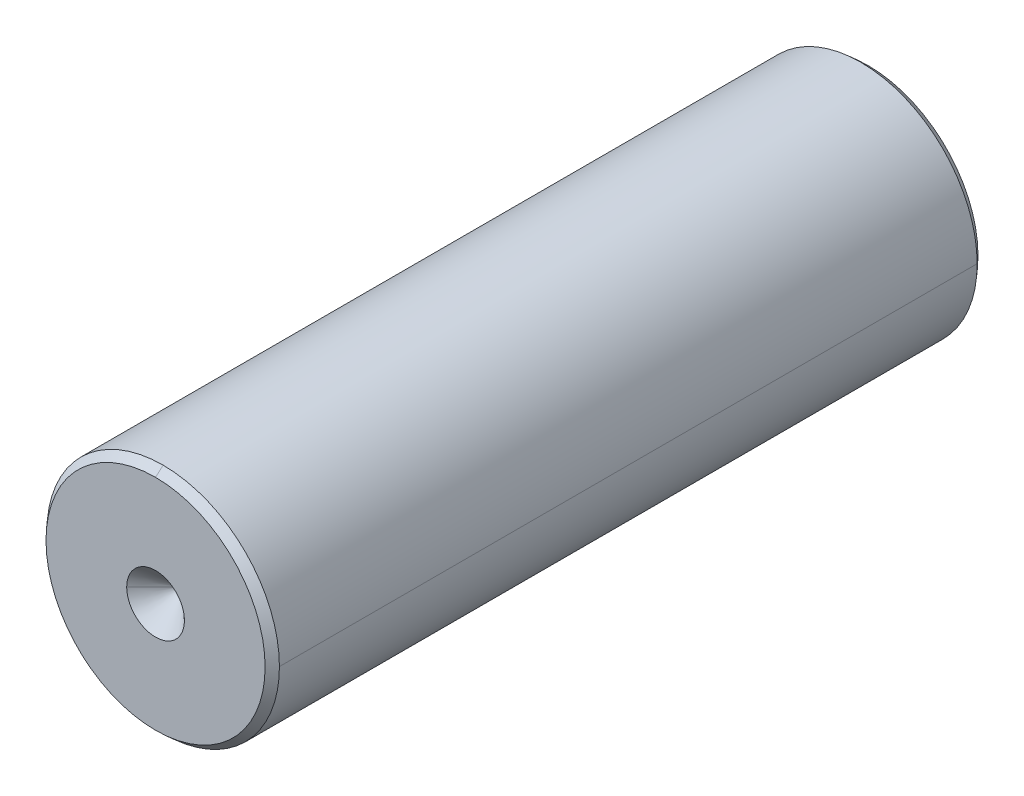
ISO-10303-21;
HEADER;
FILE_DESCRIPTION(('STEP AP214'),'2;1');
FILE_NAME('part.step','',(''),(''),'','','');
FILE_SCHEMA(('AUTOMOTIVE_DESIGN { 1 0 10303 214 1 1 1 1 }'));
ENDSEC;
DATA;
#1=APPLICATION_CONTEXT('core data for automotive mechanical design processes');
#2=APPLICATION_PROTOCOL_DEFINITION('international standard','automotive_design',2000,#1);
#3=PRODUCT_CONTEXT('',#1,'mechanical');
#4=PRODUCT('Part','Part','',(#3));
#5=PRODUCT_RELATED_PRODUCT_CATEGORY('part','',(#4));
#6=PRODUCT_DEFINITION_FORMATION('','',#4);
#7=PRODUCT_DEFINITION_CONTEXT('part definition',#1,'design');
#8=PRODUCT_DEFINITION('design','',#6,#7);
#9=PRODUCT_DEFINITION_SHAPE('','',#8);
#10=(LENGTH_UNIT() NAMED_UNIT(*) SI_UNIT(.MILLI.,.METRE.));
#11=(NAMED_UNIT(*) PLANE_ANGLE_UNIT() SI_UNIT($,.RADIAN.));
#12=(NAMED_UNIT(*) SI_UNIT($,.STERADIAN.) SOLID_ANGLE_UNIT());
#13=UNCERTAINTY_MEASURE_WITH_UNIT(LENGTH_MEASURE(1.E-05),#10,'distance_accuracy_value','');
#14=(GEOMETRIC_REPRESENTATION_CONTEXT(3) GLOBAL_UNCERTAINTY_ASSIGNED_CONTEXT((#13)) GLOBAL_UNIT_ASSIGNED_CONTEXT((#10,
#11,#12)) REPRESENTATION_CONTEXT('',''));
#15=CARTESIAN_POINT('',(0.,0.,0.));
#16=DIRECTION('',(0.,0.,1.));
#17=DIRECTION('',(1.,0.,0.));
#18=AXIS2_PLACEMENT_3D('',#15,#16,#17);
#19=CARTESIAN_POINT('',(0.,0.,-1.4625));
#20=DIRECTION('',(0.,0.,1.));
#21=DIRECTION('',(1.,0.,0.));
#22=AXIS2_PLACEMENT_3D('',#19,#20,#21);
#23=PLANE('',#22);
#24=CARTESIAN_POINT('',(0.,0.,-1.4625));
#25=DIRECTION('',(0.,0.,1.));
#26=DIRECTION('',(-1.,0.,0.));
#27=AXIS2_PLACEMENT_3D('',#24,#25,#26);
#28=CIRCLE('',#27,0.25);
#29=CARTESIAN_POINT('',(-0.25,0.,-1.4625));
#30=VERTEX_POINT('',#29);
#31=CARTESIAN_POINT('',(0.25,0.,-1.4625));
#32=VERTEX_POINT('',#31);
#33=EDGE_CURVE('E162',#30,#32,#28,.T.);
#34=ORIENTED_EDGE('',*,*,#33,.T.);
#35=CARTESIAN_POINT('',(0.,0.,-1.4625));
#36=DIRECTION('',(0.,0.,-1.));
#37=DIRECTION('',(-1.,0.,0.));
#38=AXIS2_PLACEMENT_3D('',#35,#36,#37);
#39=CIRCLE('',#38,0.25);
#40=EDGE_CURVE('E11',#30,#32,#39,.T.);
#41=ORIENTED_EDGE('',*,*,#40,.F.);
#42=EDGE_LOOP('',(#34,#41));
#43=FACE_BOUND('',#42,.T.);
#44=ADVANCED_FACE('F17',(#43),#23,.T.);
#45=CARTESIAN_POINT('',(0.,0.,-0.73125));
#46=DIRECTION('',(0.,0.,1.));
#47=DIRECTION('',(-1.,0.,0.));
#48=AXIS2_PLACEMENT_3D('',#45,#46,#47);
#49=CONICAL_SURFACE('',#48,0.98125,0.7853981633973);
#50=DIRECTION('',(-0.707106781186548,0.,0.707106781186548));
#51=VECTOR('',#50,1.);
#52=CARTESIAN_POINT('',(-0.25,0.,-1.4625));
#53=LINE('',#52,#51);
#54=CARTESIAN_POINT('',(-1.7125,0.,0.));
#55=VERTEX_POINT('',#54);
#56=EDGE_CURVE('E26',#30,#55,#53,.T.);
#57=ORIENTED_EDGE('',*,*,#56,.F.);
#58=ORIENTED_EDGE('',*,*,#40,.T.);
#59=DIRECTION('',(0.707106781186548,0.,0.707106781186548));
#60=VECTOR('',#59,1.);
#61=CARTESIAN_POINT('',(0.25,0.,-1.4625));
#62=LINE('',#61,#60);
#63=CARTESIAN_POINT('',(1.7125,0.,0.));
#64=VERTEX_POINT('',#63);
#65=EDGE_CURVE('E200',#32,#64,#62,.T.);
#66=ORIENTED_EDGE('',*,*,#65,.T.);
#67=CARTESIAN_POINT('',(0.,0.,0.));
#68=DIRECTION('',(0.,0.,1.));
#69=DIRECTION('',(1.,0.,0.));
#70=AXIS2_PLACEMENT_3D('',#67,#68,#69);
#71=CIRCLE('',#70,1.7125);
#72=EDGE_CURVE('E210',#64,#55,#71,.T.);
#73=ORIENTED_EDGE('',*,*,#72,.T.);
#74=EDGE_LOOP('',(#57,#58,#66,#73));
#75=FACE_BOUND('',#74,.T.);
#76=ADVANCED_FACE('F220',(#75),#49,.F.);
#77=CARTESIAN_POINT('',(0.,0.,-0.73125));
#78=DIRECTION('',(0.,0.,1.));
#79=DIRECTION('',(-1.,0.,0.));
#80=AXIS2_PLACEMENT_3D('',#77,#78,#79);
#81=CONICAL_SURFACE('',#80,0.98125,0.7853981633973);
#82=ORIENTED_EDGE('',*,*,#65,.F.);
#83=ORIENTED_EDGE('',*,*,#33,.F.);
#84=ORIENTED_EDGE('',*,*,#56,.T.);
#85=CARTESIAN_POINT('',(0.,0.,0.));
#86=DIRECTION('',(0.,0.,1.));
#87=DIRECTION('',(-1.,0.,0.));
#88=AXIS2_PLACEMENT_3D('',#85,#86,#87);
#89=CIRCLE('',#88,1.7125);
#90=EDGE_CURVE('E214',#55,#64,#89,.T.);
#91=ORIENTED_EDGE('',*,*,#90,.T.);
#92=EDGE_LOOP('',(#82,#83,#84,#91));
#93=FACE_BOUND('',#92,.T.);
#94=ADVANCED_FACE('F19',(#93),#81,.F.);
#95=CARTESIAN_POINT('',(0.,0.,0.));
#96=DIRECTION('',(0.,0.,-1.));
#97=DIRECTION('',(0.,-1.,0.));
#98=AXIS2_PLACEMENT_3D('',#95,#96,#97);
#99=PLANE('',#98);
#100=ORIENTED_EDGE('',*,*,#72,.F.);
#101=ORIENTED_EDGE('',*,*,#90,.F.);
#102=EDGE_LOOP('',(#100,#101));
#103=FACE_BOUND('',#102,.T.);
#104=CARTESIAN_POINT('',(0.,0.,0.));
#105=DIRECTION('',(0.,0.,-1.));
#106=DIRECTION('',(0.,1.,0.));
#107=AXIS2_PLACEMENT_3D('',#104,#105,#106);
#108=CIRCLE('',#107,6.5);
#109=CARTESIAN_POINT('',(0.,6.5,0.));
#110=VERTEX_POINT('',#109);
#111=CARTESIAN_POINT('',(0.,-6.5,0.));
#112=VERTEX_POINT('',#111);
#113=EDGE_CURVE('E207',#110,#112,#108,.T.);
#114=ORIENTED_EDGE('',*,*,#113,.F.);
#115=CARTESIAN_POINT('',(0.,0.,0.));
#116=DIRECTION('',(0.,0.,-1.));
#117=DIRECTION('',(0.,-1.,0.));
#118=AXIS2_PLACEMENT_3D('',#115,#116,#117);
#119=CIRCLE('',#118,6.5);
#120=EDGE_CURVE('E189',#112,#110,#119,.T.);
#121=ORIENTED_EDGE('',*,*,#120,.F.);
#122=EDGE_LOOP('',(#114,#121));
#123=FACE_BOUND('',#122,.T.);
#124=ADVANCED_FACE('F226',(#103,#123),#99,.F.);
#125=CARTESIAN_POINT('',(0.,0.,-0.225));
#126=DIRECTION('',(0.,0.,-1.));
#127=DIRECTION('',(0.,-1.,0.));
#128=AXIS2_PLACEMENT_3D('',#125,#126,#127);
#129=CONICAL_SURFACE('',#128,6.7,0.726642340681585);
#130=DIRECTION('',(0.,-0.664363838829889,0.747409318683687));
#131=VECTOR('',#130,1.);
#132=CARTESIAN_POINT('',(0.,6.9,-0.45));
#133=LINE('',#132,#131);
#134=CARTESIAN_POINT('',(0.,6.9,-0.45));
#135=VERTEX_POINT('',#134);
#136=EDGE_CURVE('E193',#135,#110,#133,.T.);
#137=ORIENTED_EDGE('',*,*,#136,.T.);
#138=ORIENTED_EDGE('',*,*,#113,.T.);
#139=DIRECTION('',(0.,0.664363838829889,0.747409318683687));
#140=VECTOR('',#139,1.);
#141=CARTESIAN_POINT('',(0.,-6.9,-0.45));
#142=LINE('',#141,#140);
#143=CARTESIAN_POINT('',(0.,-6.9,-0.45));
#144=VERTEX_POINT('',#143);
#145=EDGE_CURVE('E180',#144,#112,#142,.T.);
#146=ORIENTED_EDGE('',*,*,#145,.F.);
#147=CARTESIAN_POINT('',(0.,0.,-0.45));
#148=DIRECTION('',(0.,0.,-1.));
#149=DIRECTION('',(1.,0.,0.));
#150=AXIS2_PLACEMENT_3D('',#147,#148,#149);
#151=CIRCLE('',#150,6.9);
#152=CARTESIAN_POINT('',(6.9,0.,-0.45));
#153=VERTEX_POINT('',#152);
#154=EDGE_CURVE('E176',#153,#144,#151,.T.);
#155=ORIENTED_EDGE('',*,*,#154,.F.);
#156=CARTESIAN_POINT('',(0.,0.,-0.45));
#157=DIRECTION('',(0.,0.,-1.));
#158=DIRECTION('',(0.,1.,0.));
#159=AXIS2_PLACEMENT_3D('',#156,#157,#158);
#160=CIRCLE('',#159,6.9);
#161=EDGE_CURVE('E204',#135,#153,#160,.T.);
#162=ORIENTED_EDGE('',*,*,#161,.F.);
#163=EDGE_LOOP('',(#137,#138,#146,#155,#162));
#164=FACE_BOUND('',#163,.T.);
#165=ADVANCED_FACE('F229',(#164),#129,.T.);
#166=CARTESIAN_POINT('',(0.,0.,2.115));
#167=DIRECTION('',(0.,0.,-1.));
#168=DIRECTION('',(1.,0.,0.));
#169=AXIS2_PLACEMENT_3D('',#166,#167,#168);
#170=CYLINDRICAL_SURFACE('',#169,6.9);
#171=ORIENTED_EDGE('',*,*,#161,.T.);
#172=DIRECTION('',(0.,0.,1.));
#173=VECTOR('',#172,1.);
#174=CARTESIAN_POINT('',(6.9,0.,-41.85));
#175=LINE('',#174,#173);
#176=CARTESIAN_POINT('',(6.9,0.,-41.85));
#177=VERTEX_POINT('',#176);
#178=EDGE_CURVE('E167',#177,#153,#175,.T.);
#179=ORIENTED_EDGE('',*,*,#178,.F.);
#180=CARTESIAN_POINT('',(0.,0.,-41.85));
#181=DIRECTION('',(0.,0.,-1.));
#182=DIRECTION('',(0.,1.,0.));
#183=AXIS2_PLACEMENT_3D('',#180,#181,#182);
#184=CIRCLE('',#183,6.9);
#185=CARTESIAN_POINT('',(0.,6.9,-41.85));
#186=VERTEX_POINT('',#185);
#187=EDGE_CURVE('E124',#186,#177,#184,.T.);
#188=ORIENTED_EDGE('',*,*,#187,.F.);
#189=CARTESIAN_POINT('',(0.,0.,-41.85));
#190=DIRECTION('',(0.,0.,-1.));
#191=DIRECTION('',(-1.,0.,0.));
#192=AXIS2_PLACEMENT_3D('',#189,#190,#191);
#193=CIRCLE('',#192,6.9);
#194=CARTESIAN_POINT('',(-6.9,0.,-41.85));
#195=VERTEX_POINT('',#194);
#196=EDGE_CURVE('E139',#195,#186,#193,.T.);
#197=ORIENTED_EDGE('',*,*,#196,.F.);
#198=DIRECTION('',(0.,0.,1.));
#199=VECTOR('',#198,1.);
#200=CARTESIAN_POINT('',(-6.9,0.,-41.85));
#201=LINE('',#200,#199);
#202=CARTESIAN_POINT('',(-6.9,0.,-0.45));
#203=VERTEX_POINT('',#202);
#204=EDGE_CURVE('E128',#195,#203,#201,.T.);
#205=ORIENTED_EDGE('',*,*,#204,.T.);
#206=CARTESIAN_POINT('',(0.,0.,-0.45));
#207=DIRECTION('',(0.,0.,-1.));
#208=DIRECTION('',(-1.,0.,0.));
#209=AXIS2_PLACEMENT_3D('',#206,#207,#208);
#210=CIRCLE('',#209,6.9);
#211=EDGE_CURVE('E197',#203,#135,#210,.T.);
#212=ORIENTED_EDGE('',*,*,#211,.T.);
#213=EDGE_LOOP('',(#171,#179,#188,#197,#205,#212));
#214=FACE_BOUND('',#213,.T.);
#215=ADVANCED_FACE('F238',(#214),#170,.T.);
#216=CARTESIAN_POINT('',(0.,0.,-0.225));
#217=DIRECTION('',(0.,0.,-1.));
#218=DIRECTION('',(0.,-1.,0.));
#219=AXIS2_PLACEMENT_3D('',#216,#217,#218);
#220=CONICAL_SURFACE('',#219,6.7,0.726642340681585);
#221=CARTESIAN_POINT('',(0.,0.,-0.45));
#222=DIRECTION('',(0.,0.,-1.));
#223=DIRECTION('',(0.,-1.,0.));
#224=AXIS2_PLACEMENT_3D('',#221,#222,#223);
#225=CIRCLE('',#224,6.9);
#226=EDGE_CURVE('E177',#144,#203,#225,.T.);
#227=ORIENTED_EDGE('',*,*,#226,.F.);
#228=ORIENTED_EDGE('',*,*,#145,.T.);
#229=ORIENTED_EDGE('',*,*,#120,.T.);
#230=ORIENTED_EDGE('',*,*,#136,.F.);
#231=ORIENTED_EDGE('',*,*,#211,.F.);
#232=EDGE_LOOP('',(#227,#228,#229,#230,#231));
#233=FACE_BOUND('',#232,.T.);
#234=ADVANCED_FACE('F236',(#233),#220,.T.);
#235=CARTESIAN_POINT('',(0.,0.,2.115));
#236=DIRECTION('',(0.,0.,-1.));
#237=DIRECTION('',(1.,0.,0.));
#238=AXIS2_PLACEMENT_3D('',#235,#236,#237);
#239=CYLINDRICAL_SURFACE('',#238,6.9);
#240=ORIENTED_EDGE('',*,*,#204,.F.);
#241=CARTESIAN_POINT('',(0.,0.,-41.85));
#242=DIRECTION('',(0.,0.,-1.));
#243=DIRECTION('',(0.,-1.,0.));
#244=AXIS2_PLACEMENT_3D('',#241,#242,#243);
#245=CIRCLE('',#244,6.9);
#246=CARTESIAN_POINT('',(0.,-6.9,-41.85));
#247=VERTEX_POINT('',#246);
#248=EDGE_CURVE('E131',#247,#195,#245,.T.);
#249=ORIENTED_EDGE('',*,*,#248,.F.);
#250=CARTESIAN_POINT('',(0.,0.,-41.85));
#251=DIRECTION('',(0.,0.,-1.));
#252=DIRECTION('',(1.,0.,0.));
#253=AXIS2_PLACEMENT_3D('',#250,#251,#252);
#254=CIRCLE('',#253,6.9);
#255=EDGE_CURVE('E116',#177,#247,#254,.T.);
#256=ORIENTED_EDGE('',*,*,#255,.F.);
#257=ORIENTED_EDGE('',*,*,#178,.T.);
#258=ORIENTED_EDGE('',*,*,#154,.T.);
#259=ORIENTED_EDGE('',*,*,#226,.T.);
#260=EDGE_LOOP('',(#240,#249,#256,#257,#258,#259));
#261=FACE_BOUND('',#260,.T.);
#262=ADVANCED_FACE('F132',(#261),#239,.T.);
#263=CARTESIAN_POINT('',(0.,0.,-42.075));
#264=DIRECTION('',(0.,0.,1.));
#265=DIRECTION('',(0.,1.,0.));
#266=AXIS2_PLACEMENT_3D('',#263,#264,#265);
#267=CONICAL_SURFACE('',#266,6.7,0.726642340681585);
#268=DIRECTION('',(0.,0.664363838829889,0.747409318683687));
#269=VECTOR('',#268,1.);
#270=CARTESIAN_POINT('',(0.,6.5,-42.3));
#271=LINE('',#270,#269);
#272=CARTESIAN_POINT('',(0.,6.5,-42.3));
#273=VERTEX_POINT('',#272);
#274=EDGE_CURVE('E171',#273,#186,#271,.T.);
#275=ORIENTED_EDGE('',*,*,#274,.T.);
#276=ORIENTED_EDGE('',*,*,#187,.T.);
#277=ORIENTED_EDGE('',*,*,#255,.T.);
#278=DIRECTION('',(0.,-0.664363838829889,0.747409318683687));
#279=VECTOR('',#278,1.);
#280=CARTESIAN_POINT('',(0.,-6.5,-42.3));
#281=LINE('',#280,#279);
#282=CARTESIAN_POINT('',(0.,-6.5,-42.3));
#283=VERTEX_POINT('',#282);
#284=EDGE_CURVE('E122',#283,#247,#281,.T.);
#285=ORIENTED_EDGE('',*,*,#284,.F.);
#286=CARTESIAN_POINT('',(0.,0.,-42.3));
#287=DIRECTION('',(0.,0.,-1.));
#288=DIRECTION('',(0.,1.,0.));
#289=AXIS2_PLACEMENT_3D('',#286,#287,#288);
#290=CIRCLE('',#289,6.5);
#291=EDGE_CURVE('E241',#273,#283,#290,.T.);
#292=ORIENTED_EDGE('',*,*,#291,.F.);
#293=EDGE_LOOP('',(#275,#276,#277,#285,#292));
#294=FACE_BOUND('',#293,.T.);
#295=ADVANCED_FACE('F119',(#294),#267,.T.);
#296=CARTESIAN_POINT('',(0.,0.,-42.075));
#297=DIRECTION('',(0.,0.,1.));
#298=DIRECTION('',(0.,1.,0.));
#299=AXIS2_PLACEMENT_3D('',#296,#297,#298);
#300=CONICAL_SURFACE('',#299,6.7,0.726642340681585);
#301=ORIENTED_EDGE('',*,*,#284,.T.);
#302=ORIENTED_EDGE('',*,*,#248,.T.);
#303=ORIENTED_EDGE('',*,*,#196,.T.);
#304=ORIENTED_EDGE('',*,*,#274,.F.);
#305=CARTESIAN_POINT('',(0.,0.,-42.3));
#306=DIRECTION('',(0.,0.,-1.));
#307=DIRECTION('',(0.,-1.,0.));
#308=AXIS2_PLACEMENT_3D('',#305,#306,#307);
#309=CIRCLE('',#308,6.5);
#310=EDGE_CURVE('E143',#283,#273,#309,.T.);
#311=ORIENTED_EDGE('',*,*,#310,.F.);
#312=EDGE_LOOP('',(#301,#302,#303,#304,#311));
#313=FACE_BOUND('',#312,.T.);
#314=ADVANCED_FACE('F141',(#313),#300,.T.);
#315=CARTESIAN_POINT('',(0.,0.,-40.8375));
#316=DIRECTION('',(0.,0.,1.));
#317=DIRECTION('',(1.,0.,0.));
#318=AXIS2_PLACEMENT_3D('',#315,#316,#317);
#319=PLANE('',#318);
#320=CARTESIAN_POINT('',(0.,0.,-40.8375));
#321=DIRECTION('',(0.,0.,1.));
#322=DIRECTION('',(-1.,0.,0.));
#323=AXIS2_PLACEMENT_3D('',#320,#321,#322);
#324=CIRCLE('',#323,0.25);
#325=CARTESIAN_POINT('',(-0.25,0.,-40.8375));
#326=VERTEX_POINT('',#325);
#327=CARTESIAN_POINT('',(0.25,0.,-40.8375));
#328=VERTEX_POINT('',#327);
#329=EDGE_CURVE('E157',#326,#328,#324,.T.);
#330=ORIENTED_EDGE('',*,*,#329,.F.);
#331=CARTESIAN_POINT('',(0.,0.,-40.8375));
#332=DIRECTION('',(0.,0.,-1.));
#333=DIRECTION('',(-1.,0.,0.));
#334=AXIS2_PLACEMENT_3D('',#331,#332,#333);
#335=CIRCLE('',#334,0.25);
#336=EDGE_CURVE('E146',#326,#328,#335,.T.);
#337=ORIENTED_EDGE('',*,*,#336,.T.);
#338=EDGE_LOOP('',(#330,#337));
#339=FACE_BOUND('',#338,.T.);
#340=ADVANCED_FACE('F267',(#339),#319,.F.);
#341=CARTESIAN_POINT('',(0.,0.,-41.56875));
#342=DIRECTION('',(0.,0.,-1.));
#343=DIRECTION('',(1.,0.,0.));
#344=AXIS2_PLACEMENT_3D('',#341,#342,#343);
#345=CONICAL_SURFACE('',#344,0.98125,0.7853981633973);
#346=DIRECTION('',(-0.707106781186548,0.,0.707106781186548));
#347=VECTOR('',#346,1.);
#348=CARTESIAN_POINT('',(1.7125,0.,-42.3));
#349=LINE('',#348,#347);
#350=CARTESIAN_POINT('',(1.7125,0.,-42.3));
#351=VERTEX_POINT('',#350);
#352=EDGE_CURVE('E152',#351,#328,#349,.T.);
#353=ORIENTED_EDGE('',*,*,#352,.T.);
#354=ORIENTED_EDGE('',*,*,#336,.F.);
#355=DIRECTION('',(0.707106781186548,0.,0.707106781186548));
#356=VECTOR('',#355,1.);
#357=CARTESIAN_POINT('',(-1.7125,0.,-42.3));
#358=LINE('',#357,#356);
#359=CARTESIAN_POINT('',(-1.7125,0.,-42.3));
#360=VERTEX_POINT('',#359);
#361=EDGE_CURVE('E156',#360,#326,#358,.T.);
#362=ORIENTED_EDGE('',*,*,#361,.F.);
#363=CARTESIAN_POINT('',(0.,0.,-42.3));
#364=DIRECTION('',(0.,0.,1.));
#365=DIRECTION('',(1.,0.,0.));
#366=AXIS2_PLACEMENT_3D('',#363,#364,#365);
#367=CIRCLE('',#366,1.7125);
#368=EDGE_CURVE('E243',#351,#360,#367,.T.);
#369=ORIENTED_EDGE('',*,*,#368,.F.);
#370=EDGE_LOOP('',(#353,#354,#362,#369));
#371=FACE_BOUND('',#370,.T.);
#372=ADVANCED_FACE('F265',(#371),#345,.F.);
#373=CARTESIAN_POINT('',(0.,0.,-41.56875));
#374=DIRECTION('',(0.,0.,-1.));
#375=DIRECTION('',(1.,0.,0.));
#376=AXIS2_PLACEMENT_3D('',#373,#374,#375);
#377=CONICAL_SURFACE('',#376,0.98125,0.7853981633973);
#378=ORIENTED_EDGE('',*,*,#361,.T.);
#379=ORIENTED_EDGE('',*,*,#329,.T.);
#380=ORIENTED_EDGE('',*,*,#352,.F.);
#381=CARTESIAN_POINT('',(0.,0.,-42.3));
#382=DIRECTION('',(0.,0.,1.));
#383=DIRECTION('',(-1.,0.,0.));
#384=AXIS2_PLACEMENT_3D('',#381,#382,#383);
#385=CIRCLE('',#384,1.7125);
#386=EDGE_CURVE('E252',#360,#351,#385,.T.);
#387=ORIENTED_EDGE('',*,*,#386,.F.);
#388=EDGE_LOOP('',(#378,#379,#380,#387));
#389=FACE_BOUND('',#388,.T.);
#390=ADVANCED_FACE('F262',(#389),#377,.F.);
#391=CARTESIAN_POINT('',(0.,0.,-42.3));
#392=DIRECTION('',(0.,0.,-1.));
#393=DIRECTION('',(0.,-1.,0.));
#394=AXIS2_PLACEMENT_3D('',#391,#392,#393);
#395=PLANE('',#394);
#396=ORIENTED_EDGE('',*,*,#368,.T.);
#397=ORIENTED_EDGE('',*,*,#386,.T.);
#398=EDGE_LOOP('',(#396,#397));
#399=FACE_BOUND('',#398,.T.);
#400=ORIENTED_EDGE('',*,*,#291,.T.);
#401=ORIENTED_EDGE('',*,*,#310,.T.);
#402=EDGE_LOOP('',(#400,#401));
#403=FACE_BOUND('',#402,.T.);
#404=ADVANCED_FACE('F240',(#399,#403),#395,.T.);
#405=CLOSED_SHELL('',(#44,#76,#94,#124,#165,#215,#234,#262,#295,#314,#340,#372,#390,#404));
#406=MANIFOLD_SOLID_BREP('B1',#405);
#407=ADVANCED_BREP_SHAPE_REPRESENTATION('',(#18,#406),#14);
#408=SHAPE_DEFINITION_REPRESENTATION(#9,#407);
ENDSEC;
END-ISO-10303-21;
